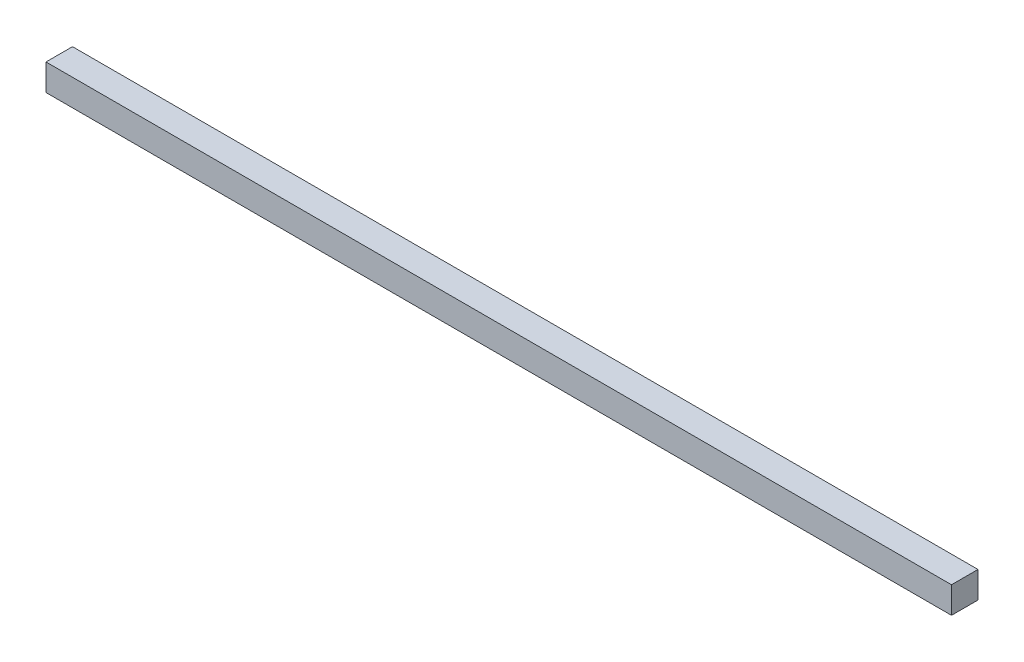
ISO-10303-21;
HEADER;
FILE_DESCRIPTION(('STEP AP214'),'2;1');
FILE_NAME('part.step','',(''),(''),'','','');
FILE_SCHEMA(('AUTOMOTIVE_DESIGN { 1 0 10303 214 1 1 1 1 }'));
ENDSEC;
DATA;
#1=APPLICATION_CONTEXT('core data for automotive mechanical design processes');
#2=APPLICATION_PROTOCOL_DEFINITION('international standard','automotive_design',2000,#1);
#3=PRODUCT_CONTEXT('',#1,'mechanical');
#4=PRODUCT('Part','Part','',(#3));
#5=PRODUCT_RELATED_PRODUCT_CATEGORY('part','',(#4));
#6=PRODUCT_DEFINITION_FORMATION('','',#4);
#7=PRODUCT_DEFINITION_CONTEXT('part definition',#1,'design');
#8=PRODUCT_DEFINITION('design','',#6,#7);
#9=PRODUCT_DEFINITION_SHAPE('','',#8);
#10=(LENGTH_UNIT() NAMED_UNIT(*) SI_UNIT(.MILLI.,.METRE.));
#11=(NAMED_UNIT(*) PLANE_ANGLE_UNIT() SI_UNIT($,.RADIAN.));
#12=(NAMED_UNIT(*) SI_UNIT($,.STERADIAN.) SOLID_ANGLE_UNIT());
#13=UNCERTAINTY_MEASURE_WITH_UNIT(LENGTH_MEASURE(1.E-05),#10,'distance_accuracy_value','');
#14=(GEOMETRIC_REPRESENTATION_CONTEXT(3) GLOBAL_UNCERTAINTY_ASSIGNED_CONTEXT((#13)) GLOBAL_UNIT_ASSIGNED_CONTEXT((#10,
#11,#12)) REPRESENTATION_CONTEXT('',''));
#15=CARTESIAN_POINT('',(0.,0.,0.));
#16=DIRECTION('',(0.,0.,1.));
#17=DIRECTION('',(1.,0.,0.));
#18=AXIS2_PLACEMENT_3D('',#15,#16,#17);
#19=CARTESIAN_POINT('',(307.5,0.,0.));
#20=DIRECTION('',(0.,0.,-1.));
#21=DIRECTION('',(-1.,0.,0.));
#22=AXIS2_PLACEMENT_3D('',#19,#20,#21);
#23=PLANE('',#22);
#24=DIRECTION('',(0.,-1.,0.));
#25=VECTOR('',#24,1.);
#26=CARTESIAN_POINT('',(0.,0.,0.));
#27=LINE('',#26,#25);
#28=CARTESIAN_POINT('',(0.,9.,0.));
#29=VERTEX_POINT('',#28);
#30=CARTESIAN_POINT('',(0.,0.,0.));
#31=VERTEX_POINT('',#30);
#32=EDGE_CURVE('E111',#29,#31,#27,.T.);
#33=ORIENTED_EDGE('',*,*,#32,.T.);
#34=DIRECTION('',(-1.,0.,0.));
#35=VECTOR('',#34,1.);
#36=CARTESIAN_POINT('',(307.5,0.,0.));
#37=LINE('',#36,#35);
#38=CARTESIAN_POINT('',(307.5,0.,0.));
#39=VERTEX_POINT('',#38);
#40=EDGE_CURVE('E11',#39,#31,#37,.T.);
#41=ORIENTED_EDGE('',*,*,#40,.F.);
#42=DIRECTION('',(0.,-1.,0.));
#43=VECTOR('',#42,1.);
#44=CARTESIAN_POINT('',(307.5,0.,0.));
#45=LINE('',#44,#43);
#46=CARTESIAN_POINT('',(307.5,9.,0.));
#47=VERTEX_POINT('',#46);
#48=EDGE_CURVE('E95',#47,#39,#45,.T.);
#49=ORIENTED_EDGE('',*,*,#48,.F.);
#50=DIRECTION('',(-1.,0.,0.));
#51=VECTOR('',#50,1.);
#52=CARTESIAN_POINT('',(307.5,9.,0.));
#53=LINE('',#52,#51);
#54=EDGE_CURVE('E107',#47,#29,#53,.T.);
#55=ORIENTED_EDGE('',*,*,#54,.T.);
#56=EDGE_LOOP('',(#33,#41,#49,#55));
#57=FACE_BOUND('',#56,.T.);
#58=ADVANCED_FACE('F43',(#57),#23,.F.);
#59=CARTESIAN_POINT('',(307.5,0.,0.));
#60=DIRECTION('',(0.,1.,0.));
#61=DIRECTION('',(0.,0.,1.));
#62=AXIS2_PLACEMENT_3D('',#59,#60,#61);
#63=PLANE('',#62);
#64=DIRECTION('',(0.,0.,-1.));
#65=VECTOR('',#64,1.);
#66=CARTESIAN_POINT('',(0.,0.,0.));
#67=LINE('',#66,#65);
#68=CARTESIAN_POINT('',(0.,0.,-9.));
#69=VERTEX_POINT('',#68);
#70=EDGE_CURVE('E100',#31,#69,#67,.T.);
#71=ORIENTED_EDGE('',*,*,#70,.T.);
#72=DIRECTION('',(-1.,0.,0.));
#73=VECTOR('',#72,1.);
#74=CARTESIAN_POINT('',(307.5,0.,-9.));
#75=LINE('',#74,#73);
#76=CARTESIAN_POINT('',(307.5,0.,-9.));
#77=VERTEX_POINT('',#76);
#78=EDGE_CURVE('E52',#77,#69,#75,.T.);
#79=ORIENTED_EDGE('',*,*,#78,.F.);
#80=DIRECTION('',(0.,0.,-1.));
#81=VECTOR('',#80,1.);
#82=CARTESIAN_POINT('',(307.5,0.,0.));
#83=LINE('',#82,#81);
#84=EDGE_CURVE('E90',#39,#77,#83,.T.);
#85=ORIENTED_EDGE('',*,*,#84,.F.);
#86=ORIENTED_EDGE('',*,*,#40,.T.);
#87=EDGE_LOOP('',(#71,#79,#85,#86));
#88=FACE_BOUND('',#87,.T.);
#89=ADVANCED_FACE('F99',(#88),#63,.F.);
#90=CARTESIAN_POINT('',(307.5,0.,-9.));
#91=DIRECTION('',(0.,0.,1.));
#92=DIRECTION('',(1.,0.,0.));
#93=AXIS2_PLACEMENT_3D('',#90,#91,#92);
#94=PLANE('',#93);
#95=DIRECTION('',(0.,1.,0.));
#96=VECTOR('',#95,1.);
#97=CARTESIAN_POINT('',(0.,0.,-9.));
#98=LINE('',#97,#96);
#99=CARTESIAN_POINT('',(0.,9.,-9.));
#100=VERTEX_POINT('',#99);
#101=EDGE_CURVE('E77',#69,#100,#98,.T.);
#102=ORIENTED_EDGE('',*,*,#101,.T.);
#103=DIRECTION('',(-1.,0.,0.));
#104=VECTOR('',#103,1.);
#105=CARTESIAN_POINT('',(307.5,9.,-9.));
#106=LINE('',#105,#104);
#107=CARTESIAN_POINT('',(307.5,9.,-9.));
#108=VERTEX_POINT('',#107);
#109=EDGE_CURVE('E102',#108,#100,#106,.T.);
#110=ORIENTED_EDGE('',*,*,#109,.F.);
#111=DIRECTION('',(0.,1.,0.));
#112=VECTOR('',#111,1.);
#113=CARTESIAN_POINT('',(307.5,0.,-9.));
#114=LINE('',#113,#112);
#115=EDGE_CURVE('E93',#77,#108,#114,.T.);
#116=ORIENTED_EDGE('',*,*,#115,.F.);
#117=ORIENTED_EDGE('',*,*,#78,.T.);
#118=EDGE_LOOP('',(#102,#110,#116,#117));
#119=FACE_BOUND('',#118,.T.);
#120=ADVANCED_FACE('F103',(#119),#94,.F.);
#121=CARTESIAN_POINT('',(307.5,9.,0.));
#122=DIRECTION('',(0.,-1.,0.));
#123=DIRECTION('',(0.,0.,-1.));
#124=AXIS2_PLACEMENT_3D('',#121,#122,#123);
#125=PLANE('',#124);
#126=DIRECTION('',(0.,0.,1.));
#127=VECTOR('',#126,1.);
#128=CARTESIAN_POINT('',(0.,9.,0.));
#129=LINE('',#128,#127);
#130=EDGE_CURVE('E83',#100,#29,#129,.T.);
#131=ORIENTED_EDGE('',*,*,#130,.T.);
#132=ORIENTED_EDGE('',*,*,#54,.F.);
#133=DIRECTION('',(0.,0.,1.));
#134=VECTOR('',#133,1.);
#135=CARTESIAN_POINT('',(307.5,9.,0.));
#136=LINE('',#135,#134);
#137=EDGE_CURVE('E60',#108,#47,#136,.T.);
#138=ORIENTED_EDGE('',*,*,#137,.F.);
#139=ORIENTED_EDGE('',*,*,#109,.T.);
#140=EDGE_LOOP('',(#131,#132,#138,#139));
#141=FACE_BOUND('',#140,.T.);
#142=ADVANCED_FACE('F124',(#141),#125,.F.);
#143=CARTESIAN_POINT('',(307.5,0.,0.));
#144=DIRECTION('',(-1.,0.,0.));
#145=DIRECTION('',(0.,0.,1.));
#146=AXIS2_PLACEMENT_3D('',#143,#144,#145);
#147=PLANE('',#146);
#148=ORIENTED_EDGE('',*,*,#48,.T.);
#149=ORIENTED_EDGE('',*,*,#84,.T.);
#150=ORIENTED_EDGE('',*,*,#115,.T.);
#151=ORIENTED_EDGE('',*,*,#137,.T.);
#152=EDGE_LOOP('',(#148,#149,#150,#151));
#153=FACE_BOUND('',#152,.T.);
#154=ADVANCED_FACE('F91',(#153),#147,.F.);
#155=CARTESIAN_POINT('',(0.,0.,0.));
#156=DIRECTION('',(-1.,0.,0.));
#157=DIRECTION('',(0.,0.,1.));
#158=AXIS2_PLACEMENT_3D('',#155,#156,#157);
#159=PLANE('',#158);
#160=ORIENTED_EDGE('',*,*,#32,.F.);
#161=ORIENTED_EDGE('',*,*,#130,.F.);
#162=ORIENTED_EDGE('',*,*,#101,.F.);
#163=ORIENTED_EDGE('',*,*,#70,.F.);
#164=EDGE_LOOP('',(#160,#161,#162,#163));
#165=FACE_BOUND('',#164,.T.);
#166=ADVANCED_FACE('F127',(#165),#159,.T.);
#167=CLOSED_SHELL('',(#58,#89,#120,#142,#154,#166));
#168=MANIFOLD_SOLID_BREP('B2',#167);
#169=ADVANCED_BREP_SHAPE_REPRESENTATION('',(#18,#168),#14);
#170=SHAPE_DEFINITION_REPRESENTATION(#9,#169);
ENDSEC;
END-ISO-10303-21;
